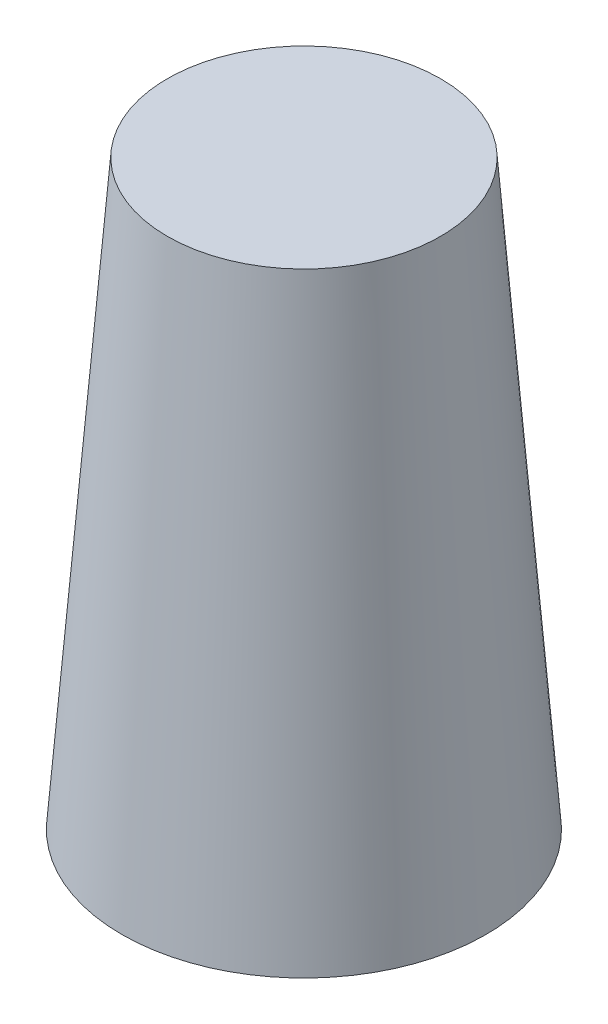
ISO-10303-21;
HEADER;
FILE_DESCRIPTION(('STEP AP214'),'2;1');
FILE_NAME('part.step','',(''),(''),'','','');
FILE_SCHEMA(('AUTOMOTIVE_DESIGN { 1 0 10303 214 1 1 1 1 }'));
ENDSEC;
DATA;
#1=APPLICATION_CONTEXT('core data for automotive mechanical design processes');
#2=APPLICATION_PROTOCOL_DEFINITION('international standard','automotive_design',2000,#1);
#3=PRODUCT_CONTEXT('',#1,'mechanical');
#4=PRODUCT('Part','Part','',(#3));
#5=PRODUCT_RELATED_PRODUCT_CATEGORY('part','',(#4));
#6=PRODUCT_DEFINITION_FORMATION('','',#4);
#7=PRODUCT_DEFINITION_CONTEXT('part definition',#1,'design');
#8=PRODUCT_DEFINITION('design','',#6,#7);
#9=PRODUCT_DEFINITION_SHAPE('','',#8);
#10=(LENGTH_UNIT() NAMED_UNIT(*) SI_UNIT(.MILLI.,.METRE.));
#11=(NAMED_UNIT(*) PLANE_ANGLE_UNIT() SI_UNIT($,.RADIAN.));
#12=(NAMED_UNIT(*) SI_UNIT($,.STERADIAN.) SOLID_ANGLE_UNIT());
#13=UNCERTAINTY_MEASURE_WITH_UNIT(LENGTH_MEASURE(1.E-05),#10,'distance_accuracy_value','');
#14=(GEOMETRIC_REPRESENTATION_CONTEXT(3) GLOBAL_UNCERTAINTY_ASSIGNED_CONTEXT((#13)) GLOBAL_UNIT_ASSIGNED_CONTEXT((#10,
#11,#12)) REPRESENTATION_CONTEXT('',''));
#15=CARTESIAN_POINT('',(0.,0.,0.));
#16=DIRECTION('',(0.,0.,1.));
#17=DIRECTION('',(1.,0.,0.));
#18=AXIS2_PLACEMENT_3D('',#15,#16,#17);
#19=CARTESIAN_POINT('',(0.,0.,0.));
#20=DIRECTION('',(0.,-1.,0.));
#21=DIRECTION('',(0.,0.,-1.));
#22=AXIS2_PLACEMENT_3D('',#19,#20,#21);
#23=PLANE('',#22);
#24=CARTESIAN_POINT('',(0.,0.,0.));
#25=DIRECTION('',(0.,-1.,0.));
#26=DIRECTION('',(0.,0.,-1.));
#27=AXIS2_PLACEMENT_3D('',#24,#25,#26);
#28=CIRCLE('',#27,34.4954134394005);
#29=CARTESIAN_POINT('',(0.,0.,-34.4954134394005));
#30=VERTEX_POINT('',#29);
#31=EDGE_CURVE('E40',#30,#30,#28,.F.);
#32=ORIENTED_EDGE('',*,*,#31,.T.);
#33=EDGE_LOOP('',(#32));
#34=FACE_BOUND('',#33,.T.);
#35=CARTESIAN_POINT('',(0.,0.,0.));
#36=DIRECTION('',(0.,1.,0.));
#37=DIRECTION('',(0.,0.,1.));
#38=AXIS2_PLACEMENT_3D('',#35,#36,#37);
#39=CIRCLE('',#38,36.);
#40=CARTESIAN_POINT('',(0.,0.,36.));
#41=VERTEX_POINT('',#40);
#42=EDGE_CURVE('E10',#41,#41,#39,.T.);
#43=ORIENTED_EDGE('',*,*,#42,.F.);
#44=EDGE_LOOP('',(#43));
#45=FACE_BOUND('',#44,.T.);
#46=ADVANCED_FACE('F30',(#34,#45),#23,.T.);
#47=CARTESIAN_POINT('',(0.,115.,0.));
#48=DIRECTION('',(0.,-1.,0.));
#49=DIRECTION('',(0.,0.,-1.));
#50=AXIS2_PLACEMENT_3D('',#47,#48,#49);
#51=CONICAL_SURFACE('',#50,27.,0.0781016777199852);
#52=ORIENTED_EDGE('',*,*,#42,.T.);
#53=EDGE_LOOP('',(#52));
#54=FACE_BOUND('',#53,.T.);
#55=CARTESIAN_POINT('',(0.,115.,0.));
#56=DIRECTION('',(0.,1.,0.));
#57=DIRECTION('',(0.,0.,1.));
#58=AXIS2_PLACEMENT_3D('',#55,#56,#57);
#59=CIRCLE('',#58,27.);
#60=CARTESIAN_POINT('',(0.,115.,27.));
#61=VERTEX_POINT('',#60);
#62=EDGE_CURVE('E36',#61,#61,#59,.T.);
#63=ORIENTED_EDGE('',*,*,#62,.F.);
#64=EDGE_LOOP('',(#63));
#65=FACE_BOUND('',#64,.T.);
#66=ADVANCED_FACE('F63',(#54,#65),#51,.T.);
#67=CARTESIAN_POINT('',(-27.,115.,0.));
#68=DIRECTION('',(0.,1.,0.));
#69=DIRECTION('',(0.,0.,1.));
#70=AXIS2_PLACEMENT_3D('',#67,#68,#69);
#71=PLANE('',#70);
#72=ORIENTED_EDGE('',*,*,#62,.T.);
#73=EDGE_LOOP('',(#72));
#74=FACE_BOUND('',#73,.T.);
#75=ADVANCED_FACE('F58',(#74),#71,.T.);
#76=CARTESIAN_POINT('',(0.,114.88296654966,0.));
#77=DIRECTION('',(0.,-1.,0.));
#78=DIRECTION('',(0.,0.,-1.));
#79=AXIS2_PLACEMENT_3D('',#76,#77,#78);
#80=CONICAL_SURFACE('',#79,25.5045725789924,0.0781016777199852);
#81=ORIENTED_EDGE('',*,*,#31,.F.);
#82=EDGE_LOOP('',(#81));
#83=FACE_BOUND('',#82,.T.);
#84=CARTESIAN_POINT('',(0.,113.5,0.));
#85=DIRECTION('',(0.,1.,0.));
#86=DIRECTION('',(0.,0.,1.));
#87=AXIS2_PLACEMENT_3D('',#84,#85,#86);
#88=CIRCLE('',#87,25.6128047437484);
#89=CARTESIAN_POINT('',(0.,113.5,25.6128047437484));
#90=VERTEX_POINT('',#89);
#91=EDGE_CURVE('E44',#90,#90,#88,.T.);
#92=ORIENTED_EDGE('',*,*,#91,.T.);
#93=EDGE_LOOP('',(#92));
#94=FACE_BOUND('',#93,.T.);
#95=ADVANCED_FACE('F50',(#83,#94),#80,.F.);
#96=CARTESIAN_POINT('',(-27.,113.5,0.));
#97=DIRECTION('',(0.,1.,0.));
#98=DIRECTION('',(0.,0.,1.));
#99=AXIS2_PLACEMENT_3D('',#96,#97,#98);
#100=PLANE('',#99);
#101=ORIENTED_EDGE('',*,*,#91,.F.);
#102=EDGE_LOOP('',(#101));
#103=FACE_BOUND('',#102,.T.);
#104=ADVANCED_FACE('F52',(#103),#100,.F.);
#105=CLOSED_SHELL('',(#46,#66,#75,#95,#104));
#106=MANIFOLD_SOLID_BREP('B2',#105);
#107=ADVANCED_BREP_SHAPE_REPRESENTATION('',(#18,#106),#14);
#108=SHAPE_DEFINITION_REPRESENTATION(#9,#107);
ENDSEC;
END-ISO-10303-21;
